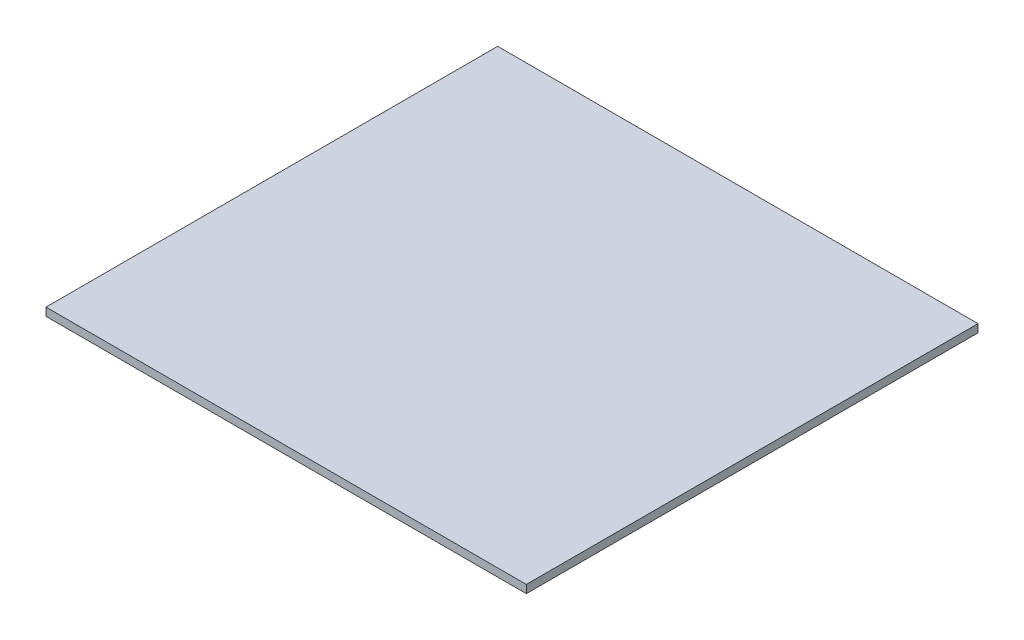
ISO-10303-21;
HEADER;
FILE_DESCRIPTION(('STEP AP214'),'2;1');
FILE_NAME('part.step','',(''),(''),'','','');
FILE_SCHEMA(('AUTOMOTIVE_DESIGN { 1 0 10303 214 1 1 1 1 }'));
ENDSEC;
DATA;
#1=APPLICATION_CONTEXT('core data for automotive mechanical design processes');
#2=APPLICATION_PROTOCOL_DEFINITION('international standard','automotive_design',2000,#1);
#3=PRODUCT_CONTEXT('',#1,'mechanical');
#4=PRODUCT('Part','Part','',(#3));
#5=PRODUCT_RELATED_PRODUCT_CATEGORY('part','',(#4));
#6=PRODUCT_DEFINITION_FORMATION('','',#4);
#7=PRODUCT_DEFINITION_CONTEXT('part definition',#1,'design');
#8=PRODUCT_DEFINITION('design','',#6,#7);
#9=PRODUCT_DEFINITION_SHAPE('','',#8);
#10=(LENGTH_UNIT() NAMED_UNIT(*) SI_UNIT(.MILLI.,.METRE.));
#11=(NAMED_UNIT(*) PLANE_ANGLE_UNIT() SI_UNIT($,.RADIAN.));
#12=(NAMED_UNIT(*) SI_UNIT($,.STERADIAN.) SOLID_ANGLE_UNIT());
#13=UNCERTAINTY_MEASURE_WITH_UNIT(LENGTH_MEASURE(1.E-05),#10,'distance_accuracy_value','');
#14=(GEOMETRIC_REPRESENTATION_CONTEXT(3) GLOBAL_UNCERTAINTY_ASSIGNED_CONTEXT((#13)) GLOBAL_UNIT_ASSIGNED_CONTEXT((#10,
#11,#12)) REPRESENTATION_CONTEXT('',''));
#15=CARTESIAN_POINT('',(0.,0.,0.));
#16=DIRECTION('',(0.,0.,1.));
#17=DIRECTION('',(1.,0.,0.));
#18=AXIS2_PLACEMENT_3D('',#15,#16,#17);
#19=CARTESIAN_POINT('',(47.945,1.6,-45.085));
#20=DIRECTION('',(-1.,0.,0.));
#21=DIRECTION('',(0.,0.,1.));
#22=AXIS2_PLACEMENT_3D('',#19,#20,#21);
#23=PLANE('',#22);
#24=DIRECTION('',(0.,0.,-1.));
#25=VECTOR('',#24,1.);
#26=CARTESIAN_POINT('',(47.945,0.,-45.085));
#27=LINE('',#26,#25);
#28=CARTESIAN_POINT('',(47.945,0.,45.085));
#29=VERTEX_POINT('',#28);
#30=CARTESIAN_POINT('',(47.945,0.,-45.085));
#31=VERTEX_POINT('',#30);
#32=EDGE_CURVE('E111',#29,#31,#27,.T.);
#33=ORIENTED_EDGE('',*,*,#32,.T.);
#34=DIRECTION('',(0.,-1.,0.));
#35=VECTOR('',#34,1.);
#36=CARTESIAN_POINT('',(47.945,1.6,-45.085));
#37=LINE('',#36,#35);
#38=CARTESIAN_POINT('',(47.945,1.6,-45.085));
#39=VERTEX_POINT('',#38);
#40=EDGE_CURVE('E11',#39,#31,#37,.T.);
#41=ORIENTED_EDGE('',*,*,#40,.F.);
#42=DIRECTION('',(0.,0.,-1.));
#43=VECTOR('',#42,1.);
#44=CARTESIAN_POINT('',(47.945,1.6,-45.085));
#45=LINE('',#44,#43);
#46=CARTESIAN_POINT('',(47.945,1.6,45.085));
#47=VERTEX_POINT('',#46);
#48=EDGE_CURVE('E95',#47,#39,#45,.T.);
#49=ORIENTED_EDGE('',*,*,#48,.F.);
#50=DIRECTION('',(0.,-1.,0.));
#51=VECTOR('',#50,1.);
#52=CARTESIAN_POINT('',(47.945,1.6,45.085));
#53=LINE('',#52,#51);
#54=EDGE_CURVE('E107',#47,#29,#53,.T.);
#55=ORIENTED_EDGE('',*,*,#54,.T.);
#56=EDGE_LOOP('',(#33,#41,#49,#55));
#57=FACE_BOUND('',#56,.T.);
#58=ADVANCED_FACE('F43',(#57),#23,.F.);
#59=CARTESIAN_POINT('',(47.945,1.6,-45.085));
#60=DIRECTION('',(0.,0.,1.));
#61=DIRECTION('',(1.,0.,0.));
#62=AXIS2_PLACEMENT_3D('',#59,#60,#61);
#63=PLANE('',#62);
#64=DIRECTION('',(-1.,0.,0.));
#65=VECTOR('',#64,1.);
#66=CARTESIAN_POINT('',(47.945,0.,-45.085));
#67=LINE('',#66,#65);
#68=CARTESIAN_POINT('',(-47.945,0.,-45.085));
#69=VERTEX_POINT('',#68);
#70=EDGE_CURVE('E100',#31,#69,#67,.T.);
#71=ORIENTED_EDGE('',*,*,#70,.T.);
#72=DIRECTION('',(0.,-1.,0.));
#73=VECTOR('',#72,1.);
#74=CARTESIAN_POINT('',(-47.945,1.6,-45.085));
#75=LINE('',#74,#73);
#76=CARTESIAN_POINT('',(-47.945,1.6,-45.085));
#77=VERTEX_POINT('',#76);
#78=EDGE_CURVE('E52',#77,#69,#75,.T.);
#79=ORIENTED_EDGE('',*,*,#78,.F.);
#80=DIRECTION('',(-1.,0.,0.));
#81=VECTOR('',#80,1.);
#82=CARTESIAN_POINT('',(47.945,1.6,-45.085));
#83=LINE('',#82,#81);
#84=EDGE_CURVE('E90',#39,#77,#83,.T.);
#85=ORIENTED_EDGE('',*,*,#84,.F.);
#86=ORIENTED_EDGE('',*,*,#40,.T.);
#87=EDGE_LOOP('',(#71,#79,#85,#86));
#88=FACE_BOUND('',#87,.T.);
#89=ADVANCED_FACE('F99',(#88),#63,.F.);
#90=CARTESIAN_POINT('',(-47.945,1.6,-45.085));
#91=DIRECTION('',(1.,0.,0.));
#92=DIRECTION('',(0.,0.,-1.));
#93=AXIS2_PLACEMENT_3D('',#90,#91,#92);
#94=PLANE('',#93);
#95=DIRECTION('',(0.,0.,1.));
#96=VECTOR('',#95,1.);
#97=CARTESIAN_POINT('',(-47.945,0.,-45.085));
#98=LINE('',#97,#96);
#99=CARTESIAN_POINT('',(-47.945,0.,45.085));
#100=VERTEX_POINT('',#99);
#101=EDGE_CURVE('E77',#69,#100,#98,.T.);
#102=ORIENTED_EDGE('',*,*,#101,.T.);
#103=DIRECTION('',(0.,-1.,0.));
#104=VECTOR('',#103,1.);
#105=CARTESIAN_POINT('',(-47.945,1.6,45.085));
#106=LINE('',#105,#104);
#107=CARTESIAN_POINT('',(-47.945,1.6,45.085));
#108=VERTEX_POINT('',#107);
#109=EDGE_CURVE('E102',#108,#100,#106,.T.);
#110=ORIENTED_EDGE('',*,*,#109,.F.);
#111=DIRECTION('',(0.,0.,1.));
#112=VECTOR('',#111,1.);
#113=CARTESIAN_POINT('',(-47.945,1.6,-45.085));
#114=LINE('',#113,#112);
#115=EDGE_CURVE('E93',#77,#108,#114,.T.);
#116=ORIENTED_EDGE('',*,*,#115,.F.);
#117=ORIENTED_EDGE('',*,*,#78,.T.);
#118=EDGE_LOOP('',(#102,#110,#116,#117));
#119=FACE_BOUND('',#118,.T.);
#120=ADVANCED_FACE('F103',(#119),#94,.F.);
#121=CARTESIAN_POINT('',(47.945,1.6,45.085));
#122=DIRECTION('',(0.,0.,-1.));
#123=DIRECTION('',(-1.,0.,0.));
#124=AXIS2_PLACEMENT_3D('',#121,#122,#123);
#125=PLANE('',#124);
#126=DIRECTION('',(1.,0.,0.));
#127=VECTOR('',#126,1.);
#128=CARTESIAN_POINT('',(47.945,0.,45.085));
#129=LINE('',#128,#127);
#130=EDGE_CURVE('E83',#100,#29,#129,.T.);
#131=ORIENTED_EDGE('',*,*,#130,.T.);
#132=ORIENTED_EDGE('',*,*,#54,.F.);
#133=DIRECTION('',(1.,0.,0.));
#134=VECTOR('',#133,1.);
#135=CARTESIAN_POINT('',(47.945,1.6,45.085));
#136=LINE('',#135,#134);
#137=EDGE_CURVE('E60',#108,#47,#136,.T.);
#138=ORIENTED_EDGE('',*,*,#137,.F.);
#139=ORIENTED_EDGE('',*,*,#109,.T.);
#140=EDGE_LOOP('',(#131,#132,#138,#139));
#141=FACE_BOUND('',#140,.T.);
#142=ADVANCED_FACE('F124',(#141),#125,.F.);
#143=CARTESIAN_POINT('',(0.,1.6,0.));
#144=DIRECTION('',(0.,-1.,0.));
#145=DIRECTION('',(0.,0.,-1.));
#146=AXIS2_PLACEMENT_3D('',#143,#144,#145);
#147=PLANE('',#146);
#148=ORIENTED_EDGE('',*,*,#48,.T.);
#149=ORIENTED_EDGE('',*,*,#84,.T.);
#150=ORIENTED_EDGE('',*,*,#115,.T.);
#151=ORIENTED_EDGE('',*,*,#137,.T.);
#152=EDGE_LOOP('',(#148,#149,#150,#151));
#153=FACE_BOUND('',#152,.T.);
#154=ADVANCED_FACE('F91',(#153),#147,.F.);
#155=CARTESIAN_POINT('',(0.,0.,0.));
#156=DIRECTION('',(0.,-1.,0.));
#157=DIRECTION('',(0.,0.,-1.));
#158=AXIS2_PLACEMENT_3D('',#155,#156,#157);
#159=PLANE('',#158);
#160=ORIENTED_EDGE('',*,*,#32,.F.);
#161=ORIENTED_EDGE('',*,*,#130,.F.);
#162=ORIENTED_EDGE('',*,*,#101,.F.);
#163=ORIENTED_EDGE('',*,*,#70,.F.);
#164=EDGE_LOOP('',(#160,#161,#162,#163));
#165=FACE_BOUND('',#164,.T.);
#166=ADVANCED_FACE('F127',(#165),#159,.T.);
#167=CLOSED_SHELL('',(#58,#89,#120,#142,#154,#166));
#168=MANIFOLD_SOLID_BREP('B2',#167);
#169=ADVANCED_BREP_SHAPE_REPRESENTATION('',(#18,#168),#14);
#170=SHAPE_DEFINITION_REPRESENTATION(#9,#169);
ENDSEC;
END-ISO-10303-21;
